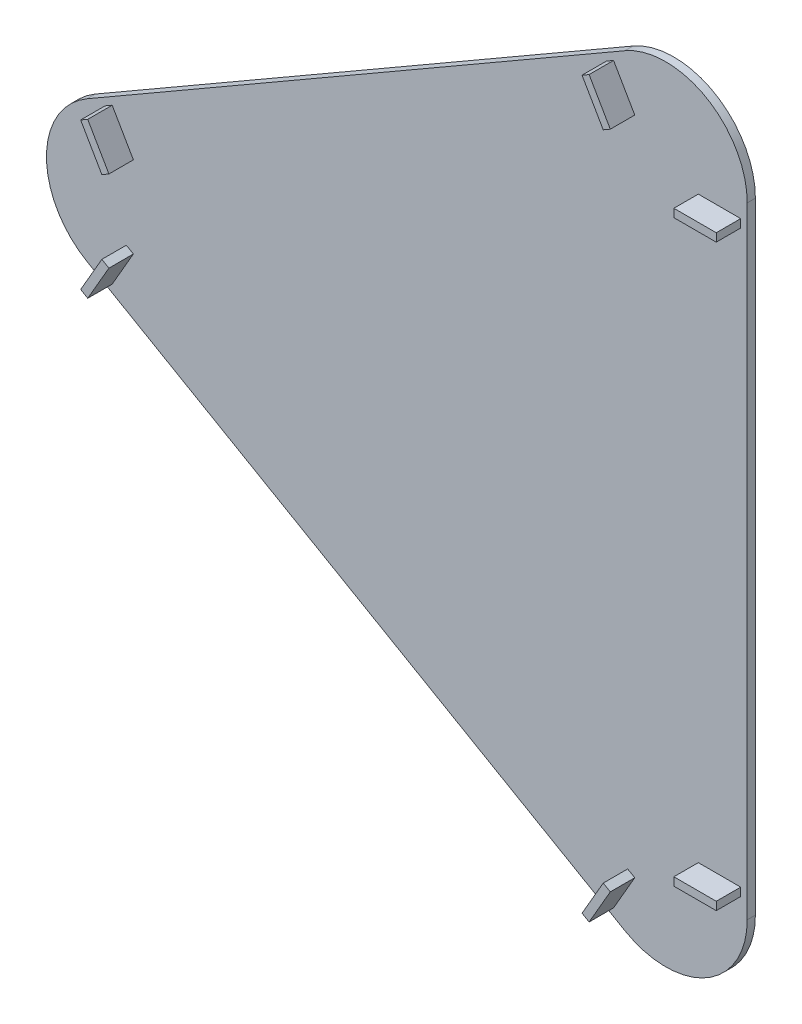
ISO-10303-21;
HEADER;
FILE_DESCRIPTION(('STEP AP214'),'2;1');
FILE_NAME('part.step','',(''),(''),'','','');
FILE_SCHEMA(('AUTOMOTIVE_DESIGN { 1 0 10303 214 1 1 1 1 }'));
ENDSEC;
DATA;
#1=APPLICATION_CONTEXT('core data for automotive mechanical design processes');
#2=APPLICATION_PROTOCOL_DEFINITION('international standard','automotive_design',2000,#1);
#3=PRODUCT_CONTEXT('',#1,'mechanical');
#4=PRODUCT('Part','Part','',(#3));
#5=PRODUCT_RELATED_PRODUCT_CATEGORY('part','',(#4));
#6=PRODUCT_DEFINITION_FORMATION('','',#4);
#7=PRODUCT_DEFINITION_CONTEXT('part definition',#1,'design');
#8=PRODUCT_DEFINITION('design','',#6,#7);
#9=PRODUCT_DEFINITION_SHAPE('','',#8);
#10=(LENGTH_UNIT() NAMED_UNIT(*) SI_UNIT(.MILLI.,.METRE.));
#11=(NAMED_UNIT(*) PLANE_ANGLE_UNIT() SI_UNIT($,.RADIAN.));
#12=(NAMED_UNIT(*) SI_UNIT($,.STERADIAN.) SOLID_ANGLE_UNIT());
#13=UNCERTAINTY_MEASURE_WITH_UNIT(LENGTH_MEASURE(1.E-05),#10,'distance_accuracy_value','');
#14=(GEOMETRIC_REPRESENTATION_CONTEXT(3) GLOBAL_UNCERTAINTY_ASSIGNED_CONTEXT((#13)) GLOBAL_UNIT_ASSIGNED_CONTEXT((#10,
#11,#12)) REPRESENTATION_CONTEXT('',''));
#15=CARTESIAN_POINT('',(0.,0.,0.));
#16=DIRECTION('',(0.,0.,1.));
#17=DIRECTION('',(1.,0.,0.));
#18=AXIS2_PLACEMENT_3D('',#15,#16,#17);
#19=CARTESIAN_POINT('',(-164.425292795656,-284.792961171466,5.));
#20=DIRECTION('',(0.5,0.866025403784439,0.));
#21=DIRECTION('',(-0.866025403784439,0.5,0.));
#22=AXIS2_PLACEMENT_3D('',#19,#20,#21);
#23=PLANE('',#22);
#24=DIRECTION('',(0.866025403784439,-0.5,0.));
#25=VECTOR('',#24,1.);
#26=CARTESIAN_POINT('',(-164.425292795656,-284.792961171466,5.));
#27=LINE('',#26,#25);
#28=CARTESIAN_POINT('',(-395.476307556361,-151.395595602837,5.));
#29=VERTEX_POINT('',#28);
#30=CARTESIAN_POINT('',(-65.7648758533638,-341.754579451459,5.));
#31=VERTEX_POINT('',#30);
#32=EDGE_CURVE('E434',#29,#31,#27,.T.);
#33=ORIENTED_EDGE('',*,*,#32,.F.);
#34=DIRECTION('',(0.,0.,-1.));
#35=VECTOR('',#34,1.);
#36=CARTESIAN_POINT('',(-395.476307556361,-151.395595602837,0.));
#37=LINE('',#36,#35);
#38=CARTESIAN_POINT('',(-395.476307556361,-151.395595602837,0.));
#39=VERTEX_POINT('',#38);
#40=EDGE_CURVE('E11',#29,#39,#37,.T.);
#41=ORIENTED_EDGE('',*,*,#40,.T.);
#42=DIRECTION('',(0.866025403784439,-0.5,0.));
#43=VECTOR('',#42,1.);
#44=CARTESIAN_POINT('',(-164.425292795656,-284.792961171466,0.));
#45=LINE('',#44,#43);
#46=CARTESIAN_POINT('',(-65.7648758533638,-341.754579451459,0.));
#47=VERTEX_POINT('',#46);
#48=EDGE_CURVE('E380',#39,#47,#45,.T.);
#49=ORIENTED_EDGE('',*,*,#48,.T.);
#50=DIRECTION('',(0.,0.,-1.));
#51=VECTOR('',#50,1.);
#52=CARTESIAN_POINT('',(-65.7648758533638,-341.754579451459,5.));
#53=LINE('',#52,#51);
#54=EDGE_CURVE('E47',#47,#31,#53,.F.);
#55=ORIENTED_EDGE('',*,*,#54,.T.);
#56=EDGE_LOOP('',(#33,#41,#49,#55));
#57=FACE_BOUND('',#56,.T.);
#58=ADVANCED_FACE('F39',(#57),#23,.F.);
#59=CARTESIAN_POINT('',(9.23512414663622,0.,5.));
#60=DIRECTION('',(-1.,0.,0.));
#61=DIRECTION('',(0.,-1.,0.));
#62=AXIS2_PLACEMENT_3D('',#59,#60,#61);
#63=PLANE('',#62);
#64=DIRECTION('',(0.,1.,0.));
#65=VECTOR('',#64,1.);
#66=CARTESIAN_POINT('',(9.23512414663622,0.,0.));
#67=LINE('',#66,#65);
#68=CARTESIAN_POINT('',(9.2351241466362,-298.453309262237,0.));
#69=VERTEX_POINT('',#68);
#70=CARTESIAN_POINT('',(9.23512414663623,82.2646584350078,0.));
#71=VERTEX_POINT('',#70);
#72=EDGE_CURVE('E444',#69,#71,#67,.T.);
#73=ORIENTED_EDGE('',*,*,#72,.T.);
#74=DIRECTION('',(0.,0.,-1.));
#75=VECTOR('',#74,1.);
#76=CARTESIAN_POINT('',(9.23512414663623,82.2646584350078,5.));
#77=LINE('',#76,#75);
#78=CARTESIAN_POINT('',(9.23512414663623,82.2646584350078,5.));
#79=VERTEX_POINT('',#78);
#80=EDGE_CURVE('E462',#71,#79,#77,.F.);
#81=ORIENTED_EDGE('',*,*,#80,.T.);
#82=DIRECTION('',(0.,1.,0.));
#83=VECTOR('',#82,1.);
#84=CARTESIAN_POINT('',(9.23512414663622,0.,5.));
#85=LINE('',#84,#83);
#86=CARTESIAN_POINT('',(9.2351241466362,-298.453309262237,5.));
#87=VERTEX_POINT('',#86);
#88=EDGE_CURVE('E436',#87,#79,#85,.T.);
#89=ORIENTED_EDGE('',*,*,#88,.F.);
#90=DIRECTION('',(0.,0.,-1.));
#91=VECTOR('',#90,1.);
#92=CARTESIAN_POINT('',(9.2351241466362,-298.453309262237,5.));
#93=LINE('',#92,#91);
#94=EDGE_CURVE('E459',#87,#69,#93,.T.);
#95=ORIENTED_EDGE('',*,*,#94,.T.);
#96=EDGE_LOOP('',(#73,#81,#89,#95));
#97=FACE_BOUND('',#96,.T.);
#98=ADVANCED_FACE('F483',(#97),#63,.F.);
#99=CARTESIAN_POINT('',(-70.8128609825242,122.651473051044,5.));
#100=DIRECTION('',(-0.5,0.866025403784438,0.));
#101=DIRECTION('',(-0.866025403784439,-0.5,0.));
#102=AXIS2_PLACEMENT_3D('',#99,#100,#101);
#103=PLANE('',#102);
#104=DIRECTION('',(0.866025403784439,0.5,0.));
#105=VECTOR('',#104,1.);
#106=CARTESIAN_POINT('',(-70.8128609825242,122.651473051044,5.));
#107=LINE('',#106,#105);
#108=CARTESIAN_POINT('',(-395.476307556361,-64.7930552243927,5.));
#109=VERTEX_POINT('',#108);
#110=CARTESIAN_POINT('',(-65.7648758533638,125.56592862423,5.));
#111=VERTEX_POINT('',#110);
#112=EDGE_CURVE('E439',#109,#111,#107,.T.);
#113=ORIENTED_EDGE('',*,*,#112,.T.);
#114=DIRECTION('',(0.,0.,-1.));
#115=VECTOR('',#114,1.);
#116=CARTESIAN_POINT('',(-65.7648758533638,125.56592862423,0.));
#117=LINE('',#116,#115);
#118=CARTESIAN_POINT('',(-65.7648758533638,125.56592862423,0.));
#119=VERTEX_POINT('',#118);
#120=EDGE_CURVE('E450',#111,#119,#117,.T.);
#121=ORIENTED_EDGE('',*,*,#120,.T.);
#122=DIRECTION('',(0.866025403784439,0.5,0.));
#123=VECTOR('',#122,1.);
#124=CARTESIAN_POINT('',(-70.8128609825242,122.651473051044,0.));
#125=LINE('',#124,#123);
#126=CARTESIAN_POINT('',(-395.476307556361,-64.7930552243927,0.));
#127=VERTEX_POINT('',#126);
#128=EDGE_CURVE('E384',#127,#119,#125,.T.);
#129=ORIENTED_EDGE('',*,*,#128,.F.);
#130=DIRECTION('',(0.,0.,-1.));
#131=VECTOR('',#130,1.);
#132=CARTESIAN_POINT('',(-395.476307556361,-64.7930552243927,5.));
#133=LINE('',#132,#131);
#134=EDGE_CURVE('E442',#127,#109,#133,.F.);
#135=ORIENTED_EDGE('',*,*,#134,.T.);
#136=EDGE_LOOP('',(#113,#121,#129,#135));
#137=FACE_BOUND('',#136,.T.);
#138=ADVANCED_FACE('F475',(#137),#103,.T.);
#139=CARTESIAN_POINT('',(0.,0.,5.));
#140=DIRECTION('',(0.,0.,1.));
#141=DIRECTION('',(1.,0.,0.));
#142=AXIS2_PLACEMENT_3D('',#139,#140,#141);
#143=PLANE('',#142);
#144=DIRECTION('',(-0.5,-0.866025403784439,0.));
#145=VECTOR('',#144,1.);
#146=CARTESIAN_POINT('',(-222.079871590405,128.217873644318,5.));
#147=LINE('',#146,#145);
#148=CARTESIAN_POINT('',(-371.505164386061,-130.594325413615,5.));
#149=VERTEX_POINT('',#148);
#150=CARTESIAN_POINT('',(-384.505164386061,-153.11098591201,5.));
#151=VERTEX_POINT('',#150);
#152=EDGE_CURVE('E381',#149,#151,#147,.T.);
#153=ORIENTED_EDGE('',*,*,#152,.F.);
#154=DIRECTION('',(0.866025403784439,-0.5,0.));
#155=VECTOR('',#154,1.);
#156=CARTESIAN_POINT('',(-149.425292795656,-258.812199057933,5.));
#157=LINE('',#156,#155);
#158=CARTESIAN_POINT('',(-367.175037367139,-133.094325413615,5.));
#159=VERTEX_POINT('',#158);
#160=EDGE_CURVE('E383',#149,#159,#157,.T.);
#161=ORIENTED_EDGE('',*,*,#160,.T.);
#162=DIRECTION('',(-0.499999999999998,-0.86602540378444,0.));
#163=VECTOR('',#162,1.);
#164=CARTESIAN_POINT('',(-217.749744571484,125.717873644318,5.));
#165=LINE('',#164,#163);
#166=CARTESIAN_POINT('',(-380.175037367139,-155.61098591201,5.));
#167=VERTEX_POINT('',#166);
#168=EDGE_CURVE('E387',#159,#167,#165,.T.);
#169=ORIENTED_EDGE('',*,*,#168,.T.);
#170=DIRECTION('',(0.866025403784442,-0.499999999999994,0.));
#171=VECTOR('',#170,1.);
#172=CARTESIAN_POINT('',(-162.425292795654,-281.328859556327,5.));
#173=LINE('',#172,#171);
#174=EDGE_CURVE('E391',#151,#167,#173,.T.);
#175=ORIENTED_EDGE('',*,*,#174,.F.);
#176=EDGE_LOOP('',(#153,#161,#169,#175));
#177=FACE_BOUND('',#176,.T.);
#178=DIRECTION('',(-0.5,-0.866025403784438,0.));
#179=VECTOR('',#178,1.);
#180=CARTESIAN_POINT('',(85.3591467530708,-49.2821263556823,5.));
#181=LINE('',#180,#179);
#182=CARTESIAN_POINT('',(-64.0661460425857,-308.094325413615,5.));
#183=VERTEX_POINT('',#182);
#184=CARTESIAN_POINT('',(-77.0661460425856,-330.61098591201,5.));
#185=VERTEX_POINT('',#184);
#186=EDGE_CURVE('E393',#183,#185,#181,.T.);
#187=ORIENTED_EDGE('',*,*,#186,.F.);
#188=CARTESIAN_POINT('',(-59.7360190236634,-310.594325413615,5.));
#189=VERTEX_POINT('',#188);
#190=EDGE_CURVE('E388',#183,#189,#157,.T.);
#191=ORIENTED_EDGE('',*,*,#190,.T.);
#192=DIRECTION('',(-0.5,-0.866025403784439,0.));
#193=VECTOR('',#192,1.);
#194=CARTESIAN_POINT('',(89.6892737719929,-51.7821263556821,5.));
#195=LINE('',#194,#193);
#196=CARTESIAN_POINT('',(-72.7360190236634,-333.11098591201,5.));
#197=VERTEX_POINT('',#196);
#198=EDGE_CURVE('E395',#189,#197,#195,.T.);
#199=ORIENTED_EDGE('',*,*,#198,.T.);
#200=DIRECTION('',(0.86602540378444,-0.499999999999999,0.));
#201=VECTOR('',#200,1.);
#202=CARTESIAN_POINT('',(-162.425292795656,-281.328859556328,5.));
#203=LINE('',#202,#201);
#204=EDGE_CURVE('E398',#185,#197,#203,.T.);
#205=ORIENTED_EDGE('',*,*,#204,.F.);
#206=EDGE_LOOP('',(#187,#191,#199,#205));
#207=FACE_BOUND('',#206,.T.);
#208=DIRECTION('',(1.,0.,0.));
#209=VECTOR('',#208,1.);
#210=CARTESIAN_POINT('',(0.,-288.094325413615,5.));
#211=LINE('',#210,#209);
#212=CARTESIAN_POINT('',(-20.7648758533638,-288.094325413615,5.));
#213=VERTEX_POINT('',#212);
#214=CARTESIAN_POINT('',(5.2351241466362,-288.094325413615,5.));
#215=VERTEX_POINT('',#214);
#216=EDGE_CURVE('E400',#213,#215,#211,.T.);
#217=ORIENTED_EDGE('',*,*,#216,.F.);
#218=DIRECTION('',(0.,1.,0.));
#219=VECTOR('',#218,1.);
#220=CARTESIAN_POINT('',(-20.7648758533637,0.,5.));
#221=LINE('',#220,#219);
#222=CARTESIAN_POINT('',(-20.7648758533638,-283.094325413615,5.));
#223=VERTEX_POINT('',#222);
#224=EDGE_CURVE('E403',#213,#223,#221,.T.);
#225=ORIENTED_EDGE('',*,*,#224,.T.);
#226=DIRECTION('',(1.,0.,0.));
#227=VECTOR('',#226,1.);
#228=CARTESIAN_POINT('',(-6.0441891964408E-13,-283.094325413615,5.));
#229=LINE('',#228,#227);
#230=CARTESIAN_POINT('',(5.2351241466362,-283.094325413615,5.));
#231=VERTEX_POINT('',#230);
#232=EDGE_CURVE('E405',#223,#231,#229,.T.);
#233=ORIENTED_EDGE('',*,*,#232,.T.);
#234=DIRECTION('',(0.,-1.,0.));
#235=VECTOR('',#234,1.);
#236=CARTESIAN_POINT('',(5.2351241466362,0.,5.));
#237=LINE('',#236,#235);
#238=EDGE_CURVE('E243',#231,#215,#237,.T.);
#239=ORIENTED_EDGE('',*,*,#238,.T.);
#240=EDGE_LOOP('',(#217,#225,#233,#239));
#241=FACE_BOUND('',#240,.T.);
#242=DIRECTION('',(1.,0.,0.));
#243=VECTOR('',#242,1.);
#244=CARTESIAN_POINT('',(0.,66.9056745863854,5.));
#245=LINE('',#244,#243);
#246=CARTESIAN_POINT('',(-20.7648758533638,66.9056745863854,5.));
#247=VERTEX_POINT('',#246);
#248=CARTESIAN_POINT('',(5.2351241466362,66.9056745863854,5.));
#249=VERTEX_POINT('',#248);
#250=EDGE_CURVE('E409',#247,#249,#245,.T.);
#251=ORIENTED_EDGE('',*,*,#250,.F.);
#252=CARTESIAN_POINT('',(-20.7648758533637,71.9056745863854,5.));
#253=VERTEX_POINT('',#252);
#254=EDGE_CURVE('E406',#247,#253,#221,.T.);
#255=ORIENTED_EDGE('',*,*,#254,.T.);
#256=DIRECTION('',(1.,0.,0.));
#257=VECTOR('',#256,1.);
#258=CARTESIAN_POINT('',(0.,71.9056745863854,5.));
#259=LINE('',#258,#257);
#260=CARTESIAN_POINT('',(5.2351241466362,71.9056745863854,5.));
#261=VERTEX_POINT('',#260);
#262=EDGE_CURVE('E411',#253,#261,#259,.T.);
#263=ORIENTED_EDGE('',*,*,#262,.T.);
#264=DIRECTION('',(0.,1.,0.));
#265=VECTOR('',#264,1.);
#266=CARTESIAN_POINT('',(5.2351241466362,0.,5.));
#267=LINE('',#266,#265);
#268=EDGE_CURVE('E414',#249,#261,#267,.T.);
#269=ORIENTED_EDGE('',*,*,#268,.F.);
#270=EDGE_LOOP('',(#251,#255,#263,#269));
#271=FACE_BOUND('',#270,.T.);
#272=DIRECTION('',(-0.5,0.866025403784439,0.));
#273=VECTOR('',#272,1.);
#274=CARTESIAN_POINT('',(-3.92315804113918,-2.26503635112515,5.));
#275=LINE('',#274,#273);
#276=CARTESIAN_POINT('',(-59.7360190236633,94.4056745863853,5.));
#277=VERTEX_POINT('',#276);
#278=CARTESIAN_POINT('',(-72.7360190236633,116.922335084781,5.));
#279=VERTEX_POINT('',#278);
#280=EDGE_CURVE('E416',#277,#279,#275,.T.);
#281=ORIENTED_EDGE('',*,*,#280,.F.);
#282=DIRECTION('',(-0.866025403784439,-0.5,0.));
#283=VECTOR('',#282,1.);
#284=CARTESIAN_POINT('',(-55.8128609825242,96.6707109375105,5.));
#285=LINE('',#284,#283);
#286=CARTESIAN_POINT('',(-64.0661460425855,91.9056745863853,5.));
#287=VERTEX_POINT('',#286);
#288=EDGE_CURVE('E418',#277,#287,#285,.T.);
#289=ORIENTED_EDGE('',*,*,#288,.T.);
#290=DIRECTION('',(-0.500000000000001,0.866025403784438,0.));
#291=VECTOR('',#290,1.);
#292=CARTESIAN_POINT('',(-8.25328506006129,-4.76503635112511,5.));
#293=LINE('',#292,#291);
#294=CARTESIAN_POINT('',(-77.0661460425854,114.42233508478,5.));
#295=VERTEX_POINT('',#294);
#296=EDGE_CURVE('E421',#287,#295,#293,.T.);
#297=ORIENTED_EDGE('',*,*,#296,.T.);
#298=DIRECTION('',(-0.866025403784412,-0.500000000000046,0.));
#299=VECTOR('',#298,1.);
#300=CARTESIAN_POINT('',(-68.8128609825306,119.187371435902,5.));
#301=LINE('',#300,#299);
#302=EDGE_CURVE('E425',#279,#295,#301,.T.);
#303=ORIENTED_EDGE('',*,*,#302,.F.);
#304=EDGE_LOOP('',(#281,#289,#297,#303));
#305=FACE_BOUND('',#304,.T.);
#306=DIRECTION('',(-0.500000000000001,0.866025403784438,0.));
#307=VECTOR('',#306,1.);
#308=CARTESIAN_POINT('',(-311.362176384615,-179.765036351125,5.));
#309=LINE('',#308,#307);
#310=CARTESIAN_POINT('',(-367.175037367139,-83.0943254136147,5.));
#311=VERTEX_POINT('',#310);
#312=CARTESIAN_POINT('',(-380.175037367139,-60.5776649152193,5.));
#313=VERTEX_POINT('',#312);
#314=EDGE_CURVE('E427',#311,#313,#309,.T.);
#315=ORIENTED_EDGE('',*,*,#314,.F.);
#316=CARTESIAN_POINT('',(-371.505164386061,-85.5943254136147,5.));
#317=VERTEX_POINT('',#316);
#318=EDGE_CURVE('E422',#311,#317,#285,.T.);
#319=ORIENTED_EDGE('',*,*,#318,.T.);
#320=DIRECTION('',(-0.500000000000001,0.866025403784438,0.));
#321=VECTOR('',#320,1.);
#322=CARTESIAN_POINT('',(-315.692303403537,-182.265036351125,5.));
#323=LINE('',#322,#321);
#324=CARTESIAN_POINT('',(-384.505164386061,-63.0776649152193,5.));
#325=VERTEX_POINT('',#324);
#326=EDGE_CURVE('E429',#317,#325,#323,.T.);
#327=ORIENTED_EDGE('',*,*,#326,.T.);
#328=DIRECTION('',(-0.866025403784439,-0.5,0.));
#329=VECTOR('',#328,1.);
#330=CARTESIAN_POINT('',(-68.8128609825243,119.187371435906,5.));
#331=LINE('',#330,#329);
#332=EDGE_CURVE('E432',#313,#325,#331,.T.);
#333=ORIENTED_EDGE('',*,*,#332,.F.);
#334=EDGE_LOOP('',(#315,#319,#327,#333));
#335=FACE_BOUND('',#334,.T.);
#336=ORIENTED_EDGE('',*,*,#88,.T.);
#337=CARTESIAN_POINT('',(-40.7648758533638,82.2646584350078,5.));
#338=DIRECTION('',(0.,0.,1.));
#339=DIRECTION('',(1.,0.,0.));
#340=AXIS2_PLACEMENT_3D('',#337,#338,#339);
#341=CIRCLE('',#340,50.);
#342=EDGE_CURVE('E467',#79,#111,#341,.T.);
#343=ORIENTED_EDGE('',*,*,#342,.T.);
#344=ORIENTED_EDGE('',*,*,#112,.F.);
#345=CARTESIAN_POINT('',(-370.476307556361,-108.094325413615,5.));
#346=DIRECTION('',(0.,0.,1.));
#347=DIRECTION('',(1.,0.,0.));
#348=AXIS2_PLACEMENT_3D('',#345,#346,#347);
#349=CIRCLE('',#348,50.);
#350=EDGE_CURVE('E60',#109,#29,#349,.T.);
#351=ORIENTED_EDGE('',*,*,#350,.T.);
#352=ORIENTED_EDGE('',*,*,#32,.T.);
#353=CARTESIAN_POINT('',(-40.7648758533638,-298.453309262237,5.));
#354=DIRECTION('',(0.,0.,1.));
#355=DIRECTION('',(1.,0.,0.));
#356=AXIS2_PLACEMENT_3D('',#353,#354,#355);
#357=CIRCLE('',#356,50.);
#358=EDGE_CURVE('E464',#31,#87,#357,.T.);
#359=ORIENTED_EDGE('',*,*,#358,.T.);
#360=EDGE_LOOP('',(#336,#343,#344,#351,#352,#359));
#361=FACE_BOUND('',#360,.T.);
#362=ADVANCED_FACE('F469',(#177,#207,#241,#271,#305,#335,#361),#143,.T.);
#363=CARTESIAN_POINT('',(0.,0.,0.));
#364=DIRECTION('',(0.,0.,1.));
#365=DIRECTION('',(1.,0.,0.));
#366=AXIS2_PLACEMENT_3D('',#363,#364,#365);
#367=PLANE('',#366);
#368=ORIENTED_EDGE('',*,*,#128,.T.);
#369=CARTESIAN_POINT('',(-40.7648758533638,82.2646584350078,0.));
#370=DIRECTION('',(0.,0.,1.));
#371=DIRECTION('',(1.,0.,0.));
#372=AXIS2_PLACEMENT_3D('',#369,#370,#371);
#373=CIRCLE('',#372,50.);
#374=EDGE_CURVE('E457',#119,#71,#373,.F.);
#375=ORIENTED_EDGE('',*,*,#374,.T.);
#376=ORIENTED_EDGE('',*,*,#72,.F.);
#377=CARTESIAN_POINT('',(-40.7648758533638,-298.453309262237,0.));
#378=DIRECTION('',(0.,0.,1.));
#379=DIRECTION('',(1.,0.,0.));
#380=AXIS2_PLACEMENT_3D('',#377,#378,#379);
#381=CIRCLE('',#380,50.);
#382=EDGE_CURVE('E453',#69,#47,#381,.F.);
#383=ORIENTED_EDGE('',*,*,#382,.T.);
#384=ORIENTED_EDGE('',*,*,#48,.F.);
#385=CARTESIAN_POINT('',(-370.476307556361,-108.094325413615,0.));
#386=DIRECTION('',(0.,0.,1.));
#387=DIRECTION('',(1.,0.,0.));
#388=AXIS2_PLACEMENT_3D('',#385,#386,#387);
#389=CIRCLE('',#388,50.);
#390=EDGE_CURVE('E455',#39,#127,#389,.F.);
#391=ORIENTED_EDGE('',*,*,#390,.T.);
#392=EDGE_LOOP('',(#368,#375,#376,#383,#384,#391));
#393=FACE_BOUND('',#392,.T.);
#394=ADVANCED_FACE('F481',(#393),#367,.F.);
#395=CARTESIAN_POINT('',(-40.7648758533638,82.2646584350078,5.));
#396=DIRECTION('',(0.,0.,1.));
#397=DIRECTION('',(1.,0.,0.));
#398=AXIS2_PLACEMENT_3D('',#395,#396,#397);
#399=CYLINDRICAL_SURFACE('',#398,50.);
#400=ORIENTED_EDGE('',*,*,#342,.F.);
#401=ORIENTED_EDGE('',*,*,#80,.F.);
#402=ORIENTED_EDGE('',*,*,#374,.F.);
#403=ORIENTED_EDGE('',*,*,#120,.F.);
#404=EDGE_LOOP('',(#400,#401,#402,#403));
#405=FACE_BOUND('',#404,.T.);
#406=ADVANCED_FACE('F478',(#405),#399,.T.);
#407=CARTESIAN_POINT('',(-370.476307556361,-108.094325413615,5.));
#408=DIRECTION('',(0.,0.,1.));
#409=DIRECTION('',(1.,0.,0.));
#410=AXIS2_PLACEMENT_3D('',#407,#408,#409);
#411=CYLINDRICAL_SURFACE('',#410,50.);
#412=ORIENTED_EDGE('',*,*,#350,.F.);
#413=ORIENTED_EDGE('',*,*,#134,.F.);
#414=ORIENTED_EDGE('',*,*,#390,.F.);
#415=ORIENTED_EDGE('',*,*,#40,.F.);
#416=EDGE_LOOP('',(#412,#413,#414,#415));
#417=FACE_BOUND('',#416,.T.);
#418=ADVANCED_FACE('F490',(#417),#411,.T.);
#419=CARTESIAN_POINT('',(-40.7648758533638,-298.453309262237,5.));
#420=DIRECTION('',(0.,0.,-1.));
#421=DIRECTION('',(-1.,0.,0.));
#422=AXIS2_PLACEMENT_3D('',#419,#420,#421);
#423=CYLINDRICAL_SURFACE('',#422,50.);
#424=ORIENTED_EDGE('',*,*,#358,.F.);
#425=ORIENTED_EDGE('',*,*,#54,.F.);
#426=ORIENTED_EDGE('',*,*,#382,.F.);
#427=ORIENTED_EDGE('',*,*,#94,.F.);
#428=EDGE_LOOP('',(#424,#425,#426,#427));
#429=FACE_BOUND('',#428,.T.);
#430=ADVANCED_FACE('F41',(#429),#423,.T.);
#431=CARTESIAN_POINT('',(0.,66.9056745863854,20.));
#432=DIRECTION('',(0.,1.,0.));
#433=DIRECTION('',(-1.,0.,0.));
#434=AXIS2_PLACEMENT_3D('',#431,#432,#433);
#435=PLANE('',#434);
#436=ORIENTED_EDGE('',*,*,#250,.T.);
#437=DIRECTION('',(0.,0.,-1.));
#438=VECTOR('',#437,1.);
#439=CARTESIAN_POINT('',(5.2351241466362,66.9056745863854,20.));
#440=LINE('',#439,#438);
#441=CARTESIAN_POINT('',(5.2351241466362,66.9056745863854,20.));
#442=VERTEX_POINT('',#441);
#443=EDGE_CURVE('E377',#442,#249,#440,.T.);
#444=ORIENTED_EDGE('',*,*,#443,.F.);
#445=DIRECTION('',(1.,0.,0.));
#446=VECTOR('',#445,1.);
#447=CARTESIAN_POINT('',(0.,66.9056745863854,20.));
#448=LINE('',#447,#446);
#449=CARTESIAN_POINT('',(-20.7648758533638,66.9056745863854,20.));
#450=VERTEX_POINT('',#449);
#451=EDGE_CURVE('E359',#450,#442,#448,.T.);
#452=ORIENTED_EDGE('',*,*,#451,.F.);
#453=DIRECTION('',(0.,0.,-1.));
#454=VECTOR('',#453,1.);
#455=CARTESIAN_POINT('',(-20.7648758533638,66.9056745863854,20.));
#456=LINE('',#455,#454);
#457=EDGE_CURVE('E369',#450,#247,#456,.T.);
#458=ORIENTED_EDGE('',*,*,#457,.T.);
#459=EDGE_LOOP('',(#436,#444,#452,#458));
#460=FACE_BOUND('',#459,.T.);
#461=ADVANCED_FACE('F496',(#460),#435,.F.);
#462=CARTESIAN_POINT('',(5.2351241466362,0.,20.));
#463=DIRECTION('',(-1.,0.,0.));
#464=DIRECTION('',(0.,0.,1.));
#465=AXIS2_PLACEMENT_3D('',#462,#463,#464);
#466=PLANE('',#465);
#467=ORIENTED_EDGE('',*,*,#268,.T.);
#468=DIRECTION('',(0.,0.,-1.));
#469=VECTOR('',#468,1.);
#470=CARTESIAN_POINT('',(5.2351241466362,71.9056745863854,20.));
#471=LINE('',#470,#469);
#472=CARTESIAN_POINT('',(5.2351241466362,71.9056745863854,20.));
#473=VERTEX_POINT('',#472);
#474=EDGE_CURVE('E374',#473,#261,#471,.T.);
#475=ORIENTED_EDGE('',*,*,#474,.F.);
#476=DIRECTION('',(0.,1.,0.));
#477=VECTOR('',#476,1.);
#478=CARTESIAN_POINT('',(5.2351241466362,0.,20.));
#479=LINE('',#478,#477);
#480=EDGE_CURVE('E362',#442,#473,#479,.T.);
#481=ORIENTED_EDGE('',*,*,#480,.F.);
#482=ORIENTED_EDGE('',*,*,#443,.T.);
#483=EDGE_LOOP('',(#467,#475,#481,#482));
#484=FACE_BOUND('',#483,.T.);
#485=ADVANCED_FACE('F514',(#484),#466,.F.);
#486=CARTESIAN_POINT('',(0.,71.9056745863854,20.));
#487=DIRECTION('',(0.,1.,0.));
#488=DIRECTION('',(0.,0.,1.));
#489=AXIS2_PLACEMENT_3D('',#486,#487,#488);
#490=PLANE('',#489);
#491=ORIENTED_EDGE('',*,*,#474,.T.);
#492=ORIENTED_EDGE('',*,*,#262,.F.);
#493=DIRECTION('',(0.,0.,-1.));
#494=VECTOR('',#493,1.);
#495=CARTESIAN_POINT('',(-20.7648758533638,71.9056745863854,20.));
#496=LINE('',#495,#494);
#497=CARTESIAN_POINT('',(-20.7648758533638,71.9056745863854,20.));
#498=VERTEX_POINT('',#497);
#499=EDGE_CURVE('E372',#498,#253,#496,.T.);
#500=ORIENTED_EDGE('',*,*,#499,.F.);
#501=DIRECTION('',(1.,0.,0.));
#502=VECTOR('',#501,1.);
#503=CARTESIAN_POINT('',(0.,71.9056745863854,20.));
#504=LINE('',#503,#502);
#505=EDGE_CURVE('E364',#498,#473,#504,.T.);
#506=ORIENTED_EDGE('',*,*,#505,.T.);
#507=EDGE_LOOP('',(#491,#492,#500,#506));
#508=FACE_BOUND('',#507,.T.);
#509=ADVANCED_FACE('F518',(#508),#490,.T.);
#510=CARTESIAN_POINT('',(-20.7648758533638,0.,20.));
#511=DIRECTION('',(1.,0.,0.));
#512=DIRECTION('',(0.,0.,-1.));
#513=AXIS2_PLACEMENT_3D('',#510,#511,#512);
#514=PLANE('',#513);
#515=ORIENTED_EDGE('',*,*,#254,.F.);
#516=ORIENTED_EDGE('',*,*,#457,.F.);
#517=DIRECTION('',(0.,-1.,0.));
#518=VECTOR('',#517,1.);
#519=CARTESIAN_POINT('',(-20.7648758533638,0.,20.));
#520=LINE('',#519,#518);
#521=EDGE_CURVE('E367',#498,#450,#520,.T.);
#522=ORIENTED_EDGE('',*,*,#521,.F.);
#523=ORIENTED_EDGE('',*,*,#499,.T.);
#524=EDGE_LOOP('',(#515,#516,#522,#523));
#525=FACE_BOUND('',#524,.T.);
#526=ADVANCED_FACE('F522',(#525),#514,.F.);
#527=CARTESIAN_POINT('',(0.,0.,20.));
#528=DIRECTION('',(0.,0.,1.));
#529=DIRECTION('',(1.,0.,0.));
#530=AXIS2_PLACEMENT_3D('',#527,#528,#529);
#531=PLANE('',#530);
#532=ORIENTED_EDGE('',*,*,#451,.T.);
#533=ORIENTED_EDGE('',*,*,#480,.T.);
#534=ORIENTED_EDGE('',*,*,#505,.F.);
#535=ORIENTED_EDGE('',*,*,#521,.T.);
#536=EDGE_LOOP('',(#532,#533,#534,#535));
#537=FACE_BOUND('',#536,.T.);
#538=ADVANCED_FACE('F526',(#537),#531,.T.);
#539=CARTESIAN_POINT('',(-3.92315804113918,-2.26503635112515,20.));
#540=DIRECTION('',(-0.866025403784439,-0.5,0.));
#541=DIRECTION('',(0.5,-0.866025403784439,0.));
#542=AXIS2_PLACEMENT_3D('',#539,#540,#541);
#543=PLANE('',#542);
#544=ORIENTED_EDGE('',*,*,#280,.T.);
#545=DIRECTION('',(0.,0.,-1.));
#546=VECTOR('',#545,1.);
#547=CARTESIAN_POINT('',(-72.7360190236633,116.922335084781,20.));
#548=LINE('',#547,#546);
#549=CARTESIAN_POINT('',(-72.7360190236633,116.922335084781,20.));
#550=VERTEX_POINT('',#549);
#551=EDGE_CURVE('E356',#550,#279,#548,.T.);
#552=ORIENTED_EDGE('',*,*,#551,.F.);
#553=DIRECTION('',(-0.5,0.866025403784439,0.));
#554=VECTOR('',#553,1.);
#555=CARTESIAN_POINT('',(-3.92315804113918,-2.26503635112515,20.));
#556=LINE('',#555,#554);
#557=CARTESIAN_POINT('',(-59.7360190236633,94.4056745863853,20.));
#558=VERTEX_POINT('',#557);
#559=EDGE_CURVE('E337',#558,#550,#556,.T.);
#560=ORIENTED_EDGE('',*,*,#559,.F.);
#561=DIRECTION('',(0.,0.,-1.));
#562=VECTOR('',#561,1.);
#563=CARTESIAN_POINT('',(-59.7360190236633,94.4056745863853,20.));
#564=LINE('',#563,#562);
#565=EDGE_CURVE('E348',#558,#277,#564,.T.);
#566=ORIENTED_EDGE('',*,*,#565,.T.);
#567=EDGE_LOOP('',(#544,#552,#560,#566));
#568=FACE_BOUND('',#567,.T.);
#569=ADVANCED_FACE('F530',(#568),#543,.F.);
#570=CARTESIAN_POINT('',(-68.8128609825306,119.187371435902,20.));
#571=DIRECTION('',(0.500000000000046,-0.866025403784412,0.));
#572=DIRECTION('',(0.866025403784412,0.500000000000046,0.));
#573=AXIS2_PLACEMENT_3D('',#570,#571,#572);
#574=PLANE('',#573);
#575=ORIENTED_EDGE('',*,*,#302,.T.);
#576=DIRECTION('',(0.,0.,-1.));
#577=VECTOR('',#576,1.);
#578=CARTESIAN_POINT('',(-77.0661460425854,114.42233508478,20.));
#579=LINE('',#578,#577);
#580=CARTESIAN_POINT('',(-77.0661460425854,114.42233508478,20.));
#581=VERTEX_POINT('',#580);
#582=EDGE_CURVE('E353',#581,#295,#579,.T.);
#583=ORIENTED_EDGE('',*,*,#582,.F.);
#584=DIRECTION('',(-0.866025403784412,-0.500000000000046,0.));
#585=VECTOR('',#584,1.);
#586=CARTESIAN_POINT('',(-68.8128609825306,119.187371435902,20.));
#587=LINE('',#586,#585);
#588=EDGE_CURVE('E340',#550,#581,#587,.T.);
#589=ORIENTED_EDGE('',*,*,#588,.F.);
#590=ORIENTED_EDGE('',*,*,#551,.T.);
#591=EDGE_LOOP('',(#575,#583,#589,#590));
#592=FACE_BOUND('',#591,.T.);
#593=ADVANCED_FACE('F534',(#592),#574,.F.);
#594=CARTESIAN_POINT('',(-8.25328506006129,-4.76503635112511,20.));
#595=DIRECTION('',(-0.866025403784438,-0.500000000000001,0.));
#596=DIRECTION('',(0.500000000000001,-0.866025403784438,0.));
#597=AXIS2_PLACEMENT_3D('',#594,#595,#596);
#598=PLANE('',#597);
#599=ORIENTED_EDGE('',*,*,#582,.T.);
#600=ORIENTED_EDGE('',*,*,#296,.F.);
#601=DIRECTION('',(0.,0.,-1.));
#602=VECTOR('',#601,1.);
#603=CARTESIAN_POINT('',(-64.0661460425855,91.9056745863853,20.));
#604=LINE('',#603,#602);
#605=CARTESIAN_POINT('',(-64.0661460425855,91.9056745863853,20.));
#606=VERTEX_POINT('',#605);
#607=EDGE_CURVE('E351',#606,#287,#604,.T.);
#608=ORIENTED_EDGE('',*,*,#607,.F.);
#609=DIRECTION('',(-0.500000000000001,0.866025403784438,0.));
#610=VECTOR('',#609,1.);
#611=CARTESIAN_POINT('',(-8.25328506006129,-4.76503635112511,20.));
#612=LINE('',#611,#610);
#613=EDGE_CURVE('E342',#606,#581,#612,.T.);
#614=ORIENTED_EDGE('',*,*,#613,.T.);
#615=EDGE_LOOP('',(#599,#600,#608,#614));
#616=FACE_BOUND('',#615,.T.);
#617=ADVANCED_FACE('F538',(#616),#598,.T.);
#618=CARTESIAN_POINT('',(-55.8128609825242,96.6707109375105,20.));
#619=DIRECTION('',(0.5,-0.866025403784439,0.));
#620=DIRECTION('',(0.866025403784439,0.5,0.));
#621=AXIS2_PLACEMENT_3D('',#618,#619,#620);
#622=PLANE('',#621);
#623=ORIENTED_EDGE('',*,*,#607,.T.);
#624=ORIENTED_EDGE('',*,*,#288,.F.);
#625=ORIENTED_EDGE('',*,*,#565,.F.);
#626=DIRECTION('',(-0.866025403784439,-0.5,0.));
#627=VECTOR('',#626,1.);
#628=CARTESIAN_POINT('',(-55.8128609825242,96.6707109375105,20.));
#629=LINE('',#628,#627);
#630=EDGE_CURVE('E345',#558,#606,#629,.T.);
#631=ORIENTED_EDGE('',*,*,#630,.T.);
#632=EDGE_LOOP('',(#623,#624,#625,#631));
#633=FACE_BOUND('',#632,.T.);
#634=ADVANCED_FACE('F542',(#633),#622,.T.);
#635=CARTESIAN_POINT('',(0.,0.,20.));
#636=DIRECTION('',(0.,0.,1.));
#637=DIRECTION('',(1.,0.,0.));
#638=AXIS2_PLACEMENT_3D('',#635,#636,#637);
#639=PLANE('',#638);
#640=ORIENTED_EDGE('',*,*,#559,.T.);
#641=ORIENTED_EDGE('',*,*,#588,.T.);
#642=ORIENTED_EDGE('',*,*,#613,.F.);
#643=ORIENTED_EDGE('',*,*,#630,.F.);
#644=EDGE_LOOP('',(#640,#641,#642,#643));
#645=FACE_BOUND('',#644,.T.);
#646=ADVANCED_FACE('F546',(#645),#639,.T.);
#647=CARTESIAN_POINT('',(-311.362176384615,-179.765036351125,20.));
#648=DIRECTION('',(-0.866025403784438,-0.500000000000001,0.));
#649=DIRECTION('',(0.500000000000001,-0.866025403784438,0.));
#650=AXIS2_PLACEMENT_3D('',#647,#648,#649);
#651=PLANE('',#650);
#652=ORIENTED_EDGE('',*,*,#314,.T.);
#653=DIRECTION('',(0.,0.,-1.));
#654=VECTOR('',#653,1.);
#655=CARTESIAN_POINT('',(-380.175037367139,-60.5776649152193,20.));
#656=LINE('',#655,#654);
#657=CARTESIAN_POINT('',(-380.175037367139,-60.5776649152193,20.));
#658=VERTEX_POINT('',#657);
#659=EDGE_CURVE('E334',#658,#313,#656,.T.);
#660=ORIENTED_EDGE('',*,*,#659,.F.);
#661=DIRECTION('',(-0.500000000000001,0.866025403784438,0.));
#662=VECTOR('',#661,1.);
#663=CARTESIAN_POINT('',(-311.362176384615,-179.765036351125,20.));
#664=LINE('',#663,#662);
#665=CARTESIAN_POINT('',(-367.175037367139,-83.0943254136147,20.));
#666=VERTEX_POINT('',#665);
#667=EDGE_CURVE('E315',#666,#658,#664,.T.);
#668=ORIENTED_EDGE('',*,*,#667,.F.);
#669=DIRECTION('',(0.,0.,-1.));
#670=VECTOR('',#669,1.);
#671=CARTESIAN_POINT('',(-367.175037367139,-83.0943254136147,20.));
#672=LINE('',#671,#670);
#673=EDGE_CURVE('E326',#666,#311,#672,.T.);
#674=ORIENTED_EDGE('',*,*,#673,.T.);
#675=EDGE_LOOP('',(#652,#660,#668,#674));
#676=FACE_BOUND('',#675,.T.);
#677=ADVANCED_FACE('F550',(#676),#651,.F.);
#678=CARTESIAN_POINT('',(-68.8128609825243,119.187371435906,20.));
#679=DIRECTION('',(0.5,-0.866025403784438,0.));
#680=DIRECTION('',(0.866025403784438,0.5,0.));
#681=AXIS2_PLACEMENT_3D('',#678,#679,#680);
#682=PLANE('',#681);
#683=ORIENTED_EDGE('',*,*,#332,.T.);
#684=DIRECTION('',(0.,0.,-1.));
#685=VECTOR('',#684,1.);
#686=CARTESIAN_POINT('',(-384.505164386061,-63.0776649152193,20.));
#687=LINE('',#686,#685);
#688=CARTESIAN_POINT('',(-384.505164386061,-63.0776649152193,20.));
#689=VERTEX_POINT('',#688);
#690=EDGE_CURVE('E331',#689,#325,#687,.T.);
#691=ORIENTED_EDGE('',*,*,#690,.F.);
#692=DIRECTION('',(-0.866025403784439,-0.5,0.));
#693=VECTOR('',#692,1.);
#694=CARTESIAN_POINT('',(-68.8128609825243,119.187371435906,20.));
#695=LINE('',#694,#693);
#696=EDGE_CURVE('E318',#658,#689,#695,.T.);
#697=ORIENTED_EDGE('',*,*,#696,.F.);
#698=ORIENTED_EDGE('',*,*,#659,.T.);
#699=EDGE_LOOP('',(#683,#691,#697,#698));
#700=FACE_BOUND('',#699,.T.);
#701=ADVANCED_FACE('F554',(#700),#682,.F.);
#702=CARTESIAN_POINT('',(-315.692303403537,-182.265036351125,20.));
#703=DIRECTION('',(-0.866025403784438,-0.500000000000001,0.));
#704=DIRECTION('',(0.500000000000001,-0.866025403784438,0.));
#705=AXIS2_PLACEMENT_3D('',#702,#703,#704);
#706=PLANE('',#705);
#707=ORIENTED_EDGE('',*,*,#690,.T.);
#708=ORIENTED_EDGE('',*,*,#326,.F.);
#709=DIRECTION('',(0.,0.,-1.));
#710=VECTOR('',#709,1.);
#711=CARTESIAN_POINT('',(-371.505164386061,-85.5943254136147,20.));
#712=LINE('',#711,#710);
#713=CARTESIAN_POINT('',(-371.505164386061,-85.5943254136147,20.));
#714=VERTEX_POINT('',#713);
#715=EDGE_CURVE('E329',#714,#317,#712,.T.);
#716=ORIENTED_EDGE('',*,*,#715,.F.);
#717=DIRECTION('',(-0.500000000000001,0.866025403784438,0.));
#718=VECTOR('',#717,1.);
#719=CARTESIAN_POINT('',(-315.692303403537,-182.265036351125,20.));
#720=LINE('',#719,#718);
#721=EDGE_CURVE('E320',#714,#689,#720,.T.);
#722=ORIENTED_EDGE('',*,*,#721,.T.);
#723=EDGE_LOOP('',(#707,#708,#716,#722));
#724=FACE_BOUND('',#723,.T.);
#725=ADVANCED_FACE('F558',(#724),#706,.T.);
#726=CARTESIAN_POINT('',(-55.8128609825242,96.6707109375105,20.));
#727=DIRECTION('',(0.5,-0.866025403784439,0.));
#728=DIRECTION('',(0.866025403784439,0.5,0.));
#729=AXIS2_PLACEMENT_3D('',#726,#727,#728);
#730=PLANE('',#729);
#731=ORIENTED_EDGE('',*,*,#715,.T.);
#732=ORIENTED_EDGE('',*,*,#318,.F.);
#733=ORIENTED_EDGE('',*,*,#673,.F.);
#734=DIRECTION('',(-0.866025403784439,-0.5,0.));
#735=VECTOR('',#734,1.);
#736=CARTESIAN_POINT('',(-55.8128609825242,96.6707109375105,20.));
#737=LINE('',#736,#735);
#738=EDGE_CURVE('E323',#666,#714,#737,.T.);
#739=ORIENTED_EDGE('',*,*,#738,.T.);
#740=EDGE_LOOP('',(#731,#732,#733,#739));
#741=FACE_BOUND('',#740,.T.);
#742=ADVANCED_FACE('F562',(#741),#730,.T.);
#743=CARTESIAN_POINT('',(0.,0.,20.));
#744=DIRECTION('',(0.,0.,1.));
#745=DIRECTION('',(1.,0.,0.));
#746=AXIS2_PLACEMENT_3D('',#743,#744,#745);
#747=PLANE('',#746);
#748=ORIENTED_EDGE('',*,*,#667,.T.);
#749=ORIENTED_EDGE('',*,*,#696,.T.);
#750=ORIENTED_EDGE('',*,*,#721,.F.);
#751=ORIENTED_EDGE('',*,*,#738,.F.);
#752=EDGE_LOOP('',(#748,#749,#750,#751));
#753=FACE_BOUND('',#752,.T.);
#754=ADVANCED_FACE('F566',(#753),#747,.T.);
#755=CARTESIAN_POINT('',(-222.079871590405,128.217873644318,20.));
#756=DIRECTION('',(0.866025403784439,-0.5,0.));
#757=DIRECTION('',(0.5,0.866025403784439,0.));
#758=AXIS2_PLACEMENT_3D('',#755,#756,#757);
#759=PLANE('',#758);
#760=ORIENTED_EDGE('',*,*,#152,.T.);
#761=DIRECTION('',(0.,0.,-1.));
#762=VECTOR('',#761,1.);
#763=CARTESIAN_POINT('',(-384.505164386061,-153.11098591201,20.));
#764=LINE('',#763,#762);
#765=CARTESIAN_POINT('',(-384.505164386061,-153.11098591201,20.));
#766=VERTEX_POINT('',#765);
#767=EDGE_CURVE('E312',#766,#151,#764,.T.);
#768=ORIENTED_EDGE('',*,*,#767,.F.);
#769=DIRECTION('',(-0.5,-0.866025403784439,0.));
#770=VECTOR('',#769,1.);
#771=CARTESIAN_POINT('',(-222.079871590405,128.217873644318,20.));
#772=LINE('',#771,#770);
#773=CARTESIAN_POINT('',(-371.505164386061,-130.594325413615,20.));
#774=VERTEX_POINT('',#773);
#775=EDGE_CURVE('E293',#774,#766,#772,.T.);
#776=ORIENTED_EDGE('',*,*,#775,.F.);
#777=DIRECTION('',(0.,0.,-1.));
#778=VECTOR('',#777,1.);
#779=CARTESIAN_POINT('',(-371.505164386061,-130.594325413615,20.));
#780=LINE('',#779,#778);
#781=EDGE_CURVE('E304',#774,#149,#780,.T.);
#782=ORIENTED_EDGE('',*,*,#781,.T.);
#783=EDGE_LOOP('',(#760,#768,#776,#782));
#784=FACE_BOUND('',#783,.T.);
#785=ADVANCED_FACE('F570',(#784),#759,.F.);
#786=CARTESIAN_POINT('',(-162.425292795654,-281.328859556327,20.));
#787=DIRECTION('',(0.499999999999994,0.866025403784442,0.));
#788=DIRECTION('',(-0.866025403784442,0.499999999999994,0.));
#789=AXIS2_PLACEMENT_3D('',#786,#787,#788);
#790=PLANE('',#789);
#791=ORIENTED_EDGE('',*,*,#174,.T.);
#792=DIRECTION('',(0.,0.,-1.));
#793=VECTOR('',#792,1.);
#794=CARTESIAN_POINT('',(-380.175037367139,-155.61098591201,20.));
#795=LINE('',#794,#793);
#796=CARTESIAN_POINT('',(-380.175037367139,-155.61098591201,20.));
#797=VERTEX_POINT('',#796);
#798=EDGE_CURVE('E309',#797,#167,#795,.T.);
#799=ORIENTED_EDGE('',*,*,#798,.F.);
#800=DIRECTION('',(0.866025403784442,-0.499999999999994,0.));
#801=VECTOR('',#800,1.);
#802=CARTESIAN_POINT('',(-162.425292795654,-281.328859556327,20.));
#803=LINE('',#802,#801);
#804=EDGE_CURVE('E296',#766,#797,#803,.T.);
#805=ORIENTED_EDGE('',*,*,#804,.F.);
#806=ORIENTED_EDGE('',*,*,#767,.T.);
#807=EDGE_LOOP('',(#791,#799,#805,#806));
#808=FACE_BOUND('',#807,.T.);
#809=ADVANCED_FACE('F574',(#808),#790,.F.);
#810=CARTESIAN_POINT('',(-217.749744571484,125.717873644318,20.));
#811=DIRECTION('',(0.86602540378444,-0.499999999999998,0.));
#812=DIRECTION('',(0.499999999999998,0.86602540378444,0.));
#813=AXIS2_PLACEMENT_3D('',#810,#811,#812);
#814=PLANE('',#813);
#815=ORIENTED_EDGE('',*,*,#798,.T.);
#816=ORIENTED_EDGE('',*,*,#168,.F.);
#817=DIRECTION('',(0.,0.,-1.));
#818=VECTOR('',#817,1.);
#819=CARTESIAN_POINT('',(-367.175037367139,-133.094325413615,20.));
#820=LINE('',#819,#818);
#821=CARTESIAN_POINT('',(-367.175037367139,-133.094325413615,20.));
#822=VERTEX_POINT('',#821);
#823=EDGE_CURVE('E307',#822,#159,#820,.T.);
#824=ORIENTED_EDGE('',*,*,#823,.F.);
#825=DIRECTION('',(-0.499999999999998,-0.86602540378444,0.));
#826=VECTOR('',#825,1.);
#827=CARTESIAN_POINT('',(-217.749744571484,125.717873644318,20.));
#828=LINE('',#827,#826);
#829=EDGE_CURVE('E298',#822,#797,#828,.T.);
#830=ORIENTED_EDGE('',*,*,#829,.T.);
#831=EDGE_LOOP('',(#815,#816,#824,#830));
#832=FACE_BOUND('',#831,.T.);
#833=ADVANCED_FACE('F578',(#832),#814,.T.);
#834=CARTESIAN_POINT('',(-149.425292795656,-258.812199057933,20.));
#835=DIRECTION('',(0.5,0.866025403784438,0.));
#836=DIRECTION('',(-0.866025403784438,0.5,0.));
#837=AXIS2_PLACEMENT_3D('',#834,#835,#836);
#838=PLANE('',#837);
#839=ORIENTED_EDGE('',*,*,#823,.T.);
#840=ORIENTED_EDGE('',*,*,#160,.F.);
#841=ORIENTED_EDGE('',*,*,#781,.F.);
#842=DIRECTION('',(0.866025403784439,-0.5,0.));
#843=VECTOR('',#842,1.);
#844=CARTESIAN_POINT('',(-149.425292795656,-258.812199057933,20.));
#845=LINE('',#844,#843);
#846=EDGE_CURVE('E301',#774,#822,#845,.T.);
#847=ORIENTED_EDGE('',*,*,#846,.T.);
#848=EDGE_LOOP('',(#839,#840,#841,#847));
#849=FACE_BOUND('',#848,.T.);
#850=ADVANCED_FACE('F582',(#849),#838,.T.);
#851=CARTESIAN_POINT('',(0.,0.,20.));
#852=DIRECTION('',(0.,0.,1.));
#853=DIRECTION('',(1.,0.,0.));
#854=AXIS2_PLACEMENT_3D('',#851,#852,#853);
#855=PLANE('',#854);
#856=ORIENTED_EDGE('',*,*,#775,.T.);
#857=ORIENTED_EDGE('',*,*,#804,.T.);
#858=ORIENTED_EDGE('',*,*,#829,.F.);
#859=ORIENTED_EDGE('',*,*,#846,.F.);
#860=EDGE_LOOP('',(#856,#857,#858,#859));
#861=FACE_BOUND('',#860,.T.);
#862=ADVANCED_FACE('F586',(#861),#855,.T.);
#863=CARTESIAN_POINT('',(85.3591467530708,-49.2821263556823,20.));
#864=DIRECTION('',(0.866025403784438,-0.5,0.));
#865=DIRECTION('',(0.5,0.866025403784438,0.));
#866=AXIS2_PLACEMENT_3D('',#863,#864,#865);
#867=PLANE('',#866);
#868=ORIENTED_EDGE('',*,*,#186,.T.);
#869=DIRECTION('',(0.,0.,-1.));
#870=VECTOR('',#869,1.);
#871=CARTESIAN_POINT('',(-77.0661460425856,-330.61098591201,20.));
#872=LINE('',#871,#870);
#873=CARTESIAN_POINT('',(-77.0661460425856,-330.61098591201,20.));
#874=VERTEX_POINT('',#873);
#875=EDGE_CURVE('E290',#874,#185,#872,.T.);
#876=ORIENTED_EDGE('',*,*,#875,.F.);
#877=DIRECTION('',(-0.5,-0.866025403784438,0.));
#878=VECTOR('',#877,1.);
#879=CARTESIAN_POINT('',(85.3591467530708,-49.2821263556823,20.));
#880=LINE('',#879,#878);
#881=CARTESIAN_POINT('',(-64.0661460425857,-308.094325413615,20.));
#882=VERTEX_POINT('',#881);
#883=EDGE_CURVE('E247',#882,#874,#880,.T.);
#884=ORIENTED_EDGE('',*,*,#883,.F.);
#885=DIRECTION('',(0.,0.,-1.));
#886=VECTOR('',#885,1.);
#887=CARTESIAN_POINT('',(-64.0661460425857,-308.094325413615,20.));
#888=LINE('',#887,#886);
#889=EDGE_CURVE('E282',#882,#183,#888,.T.);
#890=ORIENTED_EDGE('',*,*,#889,.T.);
#891=EDGE_LOOP('',(#868,#876,#884,#890));
#892=FACE_BOUND('',#891,.T.);
#893=ADVANCED_FACE('F590',(#892),#867,.F.);
#894=CARTESIAN_POINT('',(-162.425292795656,-281.328859556328,20.));
#895=DIRECTION('',(0.499999999999999,0.86602540378444,0.));
#896=DIRECTION('',(-0.86602540378444,0.499999999999999,0.));
#897=AXIS2_PLACEMENT_3D('',#894,#895,#896);
#898=PLANE('',#897);
#899=ORIENTED_EDGE('',*,*,#204,.T.);
#900=DIRECTION('',(0.,0.,-1.));
#901=VECTOR('',#900,1.);
#902=CARTESIAN_POINT('',(-72.7360190236634,-333.11098591201,20.));
#903=LINE('',#902,#901);
#904=CARTESIAN_POINT('',(-72.7360190236634,-333.11098591201,20.));
#905=VERTEX_POINT('',#904);
#906=EDGE_CURVE('E287',#905,#197,#903,.T.);
#907=ORIENTED_EDGE('',*,*,#906,.F.);
#908=DIRECTION('',(0.86602540378444,-0.499999999999999,0.));
#909=VECTOR('',#908,1.);
#910=CARTESIAN_POINT('',(-162.425292795656,-281.328859556328,20.));
#911=LINE('',#910,#909);
#912=EDGE_CURVE('E274',#874,#905,#911,.T.);
#913=ORIENTED_EDGE('',*,*,#912,.F.);
#914=ORIENTED_EDGE('',*,*,#875,.T.);
#915=EDGE_LOOP('',(#899,#907,#913,#914));
#916=FACE_BOUND('',#915,.T.);
#917=ADVANCED_FACE('F594',(#916),#898,.F.);
#918=CARTESIAN_POINT('',(89.6892737719929,-51.7821263556821,20.));
#919=DIRECTION('',(0.866025403784439,-0.5,0.));
#920=DIRECTION('',(0.5,0.866025403784439,0.));
#921=AXIS2_PLACEMENT_3D('',#918,#919,#920);
#922=PLANE('',#921);
#923=ORIENTED_EDGE('',*,*,#906,.T.);
#924=ORIENTED_EDGE('',*,*,#198,.F.);
#925=DIRECTION('',(0.,0.,-1.));
#926=VECTOR('',#925,1.);
#927=CARTESIAN_POINT('',(-59.7360190236635,-310.594325413615,20.));
#928=LINE('',#927,#926);
#929=CARTESIAN_POINT('',(-59.7360190236635,-310.594325413615,20.));
#930=VERTEX_POINT('',#929);
#931=EDGE_CURVE('E285',#930,#189,#928,.T.);
#932=ORIENTED_EDGE('',*,*,#931,.F.);
#933=DIRECTION('',(-0.5,-0.866025403784439,0.));
#934=VECTOR('',#933,1.);
#935=CARTESIAN_POINT('',(89.6892737719929,-51.7821263556821,20.));
#936=LINE('',#935,#934);
#937=EDGE_CURVE('E276',#930,#905,#936,.T.);
#938=ORIENTED_EDGE('',*,*,#937,.T.);
#939=EDGE_LOOP('',(#923,#924,#932,#938));
#940=FACE_BOUND('',#939,.T.);
#941=ADVANCED_FACE('F598',(#940),#922,.T.);
#942=CARTESIAN_POINT('',(-149.425292795656,-258.812199057933,20.));
#943=DIRECTION('',(0.5,0.866025403784438,0.));
#944=DIRECTION('',(-0.866025403784438,0.5,0.));
#945=AXIS2_PLACEMENT_3D('',#942,#943,#944);
#946=PLANE('',#945);
#947=ORIENTED_EDGE('',*,*,#931,.T.);
#948=ORIENTED_EDGE('',*,*,#190,.F.);
#949=ORIENTED_EDGE('',*,*,#889,.F.);
#950=DIRECTION('',(0.866025403784439,-0.5,0.));
#951=VECTOR('',#950,1.);
#952=CARTESIAN_POINT('',(-149.425292795656,-258.812199057933,20.));
#953=LINE('',#952,#951);
#954=EDGE_CURVE('E279',#882,#930,#953,.T.);
#955=ORIENTED_EDGE('',*,*,#954,.T.);
#956=EDGE_LOOP('',(#947,#948,#949,#955));
#957=FACE_BOUND('',#956,.T.);
#958=ADVANCED_FACE('F602',(#957),#946,.T.);
#959=CARTESIAN_POINT('',(0.,0.,20.));
#960=DIRECTION('',(0.,0.,1.));
#961=DIRECTION('',(1.,0.,0.));
#962=AXIS2_PLACEMENT_3D('',#959,#960,#961);
#963=PLANE('',#962);
#964=ORIENTED_EDGE('',*,*,#883,.T.);
#965=ORIENTED_EDGE('',*,*,#912,.T.);
#966=ORIENTED_EDGE('',*,*,#937,.F.);
#967=ORIENTED_EDGE('',*,*,#954,.F.);
#968=EDGE_LOOP('',(#964,#965,#966,#967));
#969=FACE_BOUND('',#968,.T.);
#970=ADVANCED_FACE('F606',(#969),#963,.T.);
#971=CARTESIAN_POINT('',(5.2351241466362,0.,20.));
#972=DIRECTION('',(1.,0.,0.));
#973=DIRECTION('',(0.,0.,-1.));
#974=AXIS2_PLACEMENT_3D('',#971,#972,#973);
#975=PLANE('',#974);
#976=DIRECTION('',(0.,0.,-1.));
#977=VECTOR('',#976,1.);
#978=CARTESIAN_POINT('',(5.2351241466362,-288.094325413615,20.));
#979=LINE('',#978,#977);
#980=CARTESIAN_POINT('',(5.2351241466362,-288.094325413615,20.));
#981=VERTEX_POINT('',#980);
#982=EDGE_CURVE('E266',#981,#215,#979,.T.);
#983=ORIENTED_EDGE('',*,*,#982,.T.);
#984=ORIENTED_EDGE('',*,*,#238,.F.);
#985=DIRECTION('',(0.,0.,-1.));
#986=VECTOR('',#985,1.);
#987=CARTESIAN_POINT('',(5.2351241466362,-283.094325413615,20.));
#988=LINE('',#987,#986);
#989=CARTESIAN_POINT('',(5.2351241466362,-283.094325413615,20.));
#990=VERTEX_POINT('',#989);
#991=EDGE_CURVE('E238',#990,#231,#988,.T.);
#992=ORIENTED_EDGE('',*,*,#991,.F.);
#993=DIRECTION('',(0.,-1.,0.));
#994=VECTOR('',#993,1.);
#995=CARTESIAN_POINT('',(5.2351241466362,0.,20.));
#996=LINE('',#995,#994);
#997=EDGE_CURVE('E242',#990,#981,#996,.T.);
#998=ORIENTED_EDGE('',*,*,#997,.T.);
#999=EDGE_LOOP('',(#983,#984,#992,#998));
#1000=FACE_BOUND('',#999,.T.);
#1001=ADVANCED_FACE('F241',(#1000),#975,.T.);
#1002=CARTESIAN_POINT('',(-6.0441891964408E-13,-283.094325413615,20.));
#1003=DIRECTION('',(0.,1.,0.));
#1004=DIRECTION('',(-1.,0.,0.));
#1005=AXIS2_PLACEMENT_3D('',#1002,#1003,#1004);
#1006=PLANE('',#1005);
#1007=ORIENTED_EDGE('',*,*,#991,.T.);
#1008=ORIENTED_EDGE('',*,*,#232,.F.);
#1009=DIRECTION('',(0.,0.,-1.));
#1010=VECTOR('',#1009,1.);
#1011=CARTESIAN_POINT('',(-20.7648758533638,-283.094325413615,20.));
#1012=LINE('',#1011,#1010);
#1013=CARTESIAN_POINT('',(-20.7648758533638,-283.094325413615,20.));
#1014=VERTEX_POINT('',#1013);
#1015=EDGE_CURVE('E248',#1014,#223,#1012,.T.);
#1016=ORIENTED_EDGE('',*,*,#1015,.F.);
#1017=DIRECTION('',(1.,0.,0.));
#1018=VECTOR('',#1017,1.);
#1019=CARTESIAN_POINT('',(-6.0441891964408E-13,-283.094325413615,20.));
#1020=LINE('',#1019,#1018);
#1021=EDGE_CURVE('E253',#1014,#990,#1020,.T.);
#1022=ORIENTED_EDGE('',*,*,#1021,.T.);
#1023=EDGE_LOOP('',(#1007,#1008,#1016,#1022));
#1024=FACE_BOUND('',#1023,.T.);
#1025=ADVANCED_FACE('F258',(#1024),#1006,.T.);
#1026=CARTESIAN_POINT('',(-20.7648758533636,0.,20.));
#1027=DIRECTION('',(1.,0.,0.));
#1028=DIRECTION('',(0.,1.,0.));
#1029=AXIS2_PLACEMENT_3D('',#1026,#1027,#1028);
#1030=PLANE('',#1029);
#1031=ORIENTED_EDGE('',*,*,#224,.F.);
#1032=DIRECTION('',(0.,0.,-1.));
#1033=VECTOR('',#1032,1.);
#1034=CARTESIAN_POINT('',(-20.7648758533638,-288.094325413615,20.));
#1035=LINE('',#1034,#1033);
#1036=CARTESIAN_POINT('',(-20.7648758533638,-288.094325413615,20.));
#1037=VERTEX_POINT('',#1036);
#1038=EDGE_CURVE('E268',#1037,#213,#1035,.T.);
#1039=ORIENTED_EDGE('',*,*,#1038,.F.);
#1040=DIRECTION('',(0.,-1.,0.));
#1041=VECTOR('',#1040,1.);
#1042=CARTESIAN_POINT('',(-20.7648758533636,0.,20.));
#1043=LINE('',#1042,#1041);
#1044=EDGE_CURVE('E261',#1014,#1037,#1043,.T.);
#1045=ORIENTED_EDGE('',*,*,#1044,.F.);
#1046=ORIENTED_EDGE('',*,*,#1015,.T.);
#1047=EDGE_LOOP('',(#1031,#1039,#1045,#1046));
#1048=FACE_BOUND('',#1047,.T.);
#1049=ADVANCED_FACE('F615',(#1048),#1030,.F.);
#1050=CARTESIAN_POINT('',(0.,-288.094325413615,20.));
#1051=DIRECTION('',(0.,1.,0.));
#1052=DIRECTION('',(0.,0.,1.));
#1053=AXIS2_PLACEMENT_3D('',#1050,#1051,#1052);
#1054=PLANE('',#1053);
#1055=ORIENTED_EDGE('',*,*,#216,.T.);
#1056=ORIENTED_EDGE('',*,*,#982,.F.);
#1057=DIRECTION('',(1.,0.,0.));
#1058=VECTOR('',#1057,1.);
#1059=CARTESIAN_POINT('',(0.,-288.094325413615,20.));
#1060=LINE('',#1059,#1058);
#1061=EDGE_CURVE('E255',#1037,#981,#1060,.T.);
#1062=ORIENTED_EDGE('',*,*,#1061,.F.);
#1063=ORIENTED_EDGE('',*,*,#1038,.T.);
#1064=EDGE_LOOP('',(#1055,#1056,#1062,#1063));
#1065=FACE_BOUND('',#1064,.T.);
#1066=ADVANCED_FACE('F618',(#1065),#1054,.F.);
#1067=CARTESIAN_POINT('',(0.,0.,20.));
#1068=DIRECTION('',(0.,0.,1.));
#1069=DIRECTION('',(1.,0.,0.));
#1070=AXIS2_PLACEMENT_3D('',#1067,#1068,#1069);
#1071=PLANE('',#1070);
#1072=ORIENTED_EDGE('',*,*,#997,.F.);
#1073=ORIENTED_EDGE('',*,*,#1021,.F.);
#1074=ORIENTED_EDGE('',*,*,#1044,.T.);
#1075=ORIENTED_EDGE('',*,*,#1061,.T.);
#1076=EDGE_LOOP('',(#1072,#1073,#1074,#1075));
#1077=FACE_BOUND('',#1076,.T.);
#1078=ADVANCED_FACE('F252',(#1077),#1071,.T.);
#1079=CLOSED_SHELL('',(#58,#98,#138,#362,#394,#406,#418,#430,#461,#485,#509,#526,#538,#569,#593,
#617,#634,#646,#677,#701,#725,#742,#754,#785,#809,#833,#850,#862,#893,#917,#941,#958,#970,#1001,
#1025,#1049,#1066,#1078));
#1080=MANIFOLD_SOLID_BREP('B2',#1079);
#1081=ADVANCED_BREP_SHAPE_REPRESENTATION('',(#18,#1080),#14);
#1082=SHAPE_DEFINITION_REPRESENTATION(#9,#1081);
ENDSEC;
END-ISO-10303-21;
